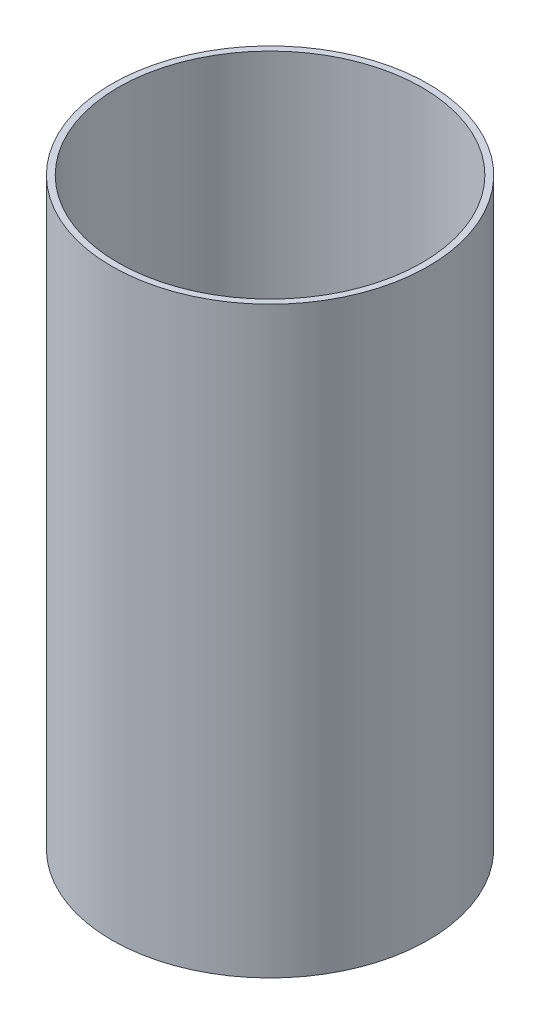
ISO-10303-21;
HEADER;
FILE_DESCRIPTION(('STEP AP214'),'2;1');
FILE_NAME('part.step','',(''),(''),'','','');
FILE_SCHEMA(('AUTOMOTIVE_DESIGN { 1 0 10303 214 1 1 1 1 }'));
ENDSEC;
DATA;
#1=APPLICATION_CONTEXT('core data for automotive mechanical design processes');
#2=APPLICATION_PROTOCOL_DEFINITION('international standard','automotive_design',2000,#1);
#3=PRODUCT_CONTEXT('',#1,'mechanical');
#4=PRODUCT('Part','Part','',(#3));
#5=PRODUCT_RELATED_PRODUCT_CATEGORY('part','',(#4));
#6=PRODUCT_DEFINITION_FORMATION('','',#4);
#7=PRODUCT_DEFINITION_CONTEXT('part definition',#1,'design');
#8=PRODUCT_DEFINITION('design','',#6,#7);
#9=PRODUCT_DEFINITION_SHAPE('','',#8);
#10=(LENGTH_UNIT() NAMED_UNIT(*) SI_UNIT(.MILLI.,.METRE.));
#11=(NAMED_UNIT(*) PLANE_ANGLE_UNIT() SI_UNIT($,.RADIAN.));
#12=(NAMED_UNIT(*) SI_UNIT($,.STERADIAN.) SOLID_ANGLE_UNIT());
#13=UNCERTAINTY_MEASURE_WITH_UNIT(LENGTH_MEASURE(1.E-05),#10,'distance_accuracy_value','');
#14=(GEOMETRIC_REPRESENTATION_CONTEXT(3) GLOBAL_UNCERTAINTY_ASSIGNED_CONTEXT((#13)) GLOBAL_UNIT_ASSIGNED_CONTEXT((#10,
#11,#12)) REPRESENTATION_CONTEXT('',''));
#15=CARTESIAN_POINT('',(0.,0.,0.));
#16=DIRECTION('',(0.,0.,1.));
#17=DIRECTION('',(1.,0.,0.));
#18=AXIS2_PLACEMENT_3D('',#15,#16,#17);
#19=CARTESIAN_POINT('',(0.,140.,0.));
#20=DIRECTION('',(0.,1.,0.));
#21=DIRECTION('',(0.,0.,1.));
#22=AXIS2_PLACEMENT_3D('',#19,#20,#21);
#23=PLANE('',#22);
#24=CARTESIAN_POINT('',(0.,140.,0.));
#25=DIRECTION('',(0.,1.,0.));
#26=DIRECTION('',(0.,0.,1.));
#27=AXIS2_PLACEMENT_3D('',#24,#25,#26);
#28=CIRCLE('',#27,37.95);
#29=CARTESIAN_POINT('',(0.,140.,37.95));
#30=VERTEX_POINT('',#29);
#31=EDGE_CURVE('E10',#30,#30,#28,.T.);
#32=ORIENTED_EDGE('',*,*,#31,.T.);
#33=EDGE_LOOP('',(#32));
#34=FACE_BOUND('',#33,.T.);
#35=CARTESIAN_POINT('',(0.,140.,0.));
#36=DIRECTION('',(0.,1.,0.));
#37=DIRECTION('',(0.,0.,1.));
#38=AXIS2_PLACEMENT_3D('',#35,#36,#37);
#39=CIRCLE('',#38,36.45);
#40=CARTESIAN_POINT('',(0.,140.,36.45));
#41=VERTEX_POINT('',#40);
#42=EDGE_CURVE('E44',#41,#41,#39,.T.);
#43=ORIENTED_EDGE('',*,*,#42,.F.);
#44=EDGE_LOOP('',(#43));
#45=FACE_BOUND('',#44,.T.);
#46=ADVANCED_FACE('F33',(#34,#45),#23,.T.);
#47=CARTESIAN_POINT('',(0.,0.,0.));
#48=DIRECTION('',(0.,1.,0.));
#49=DIRECTION('',(0.,0.,1.));
#50=AXIS2_PLACEMENT_3D('',#47,#48,#49);
#51=PLANE('',#50);
#52=CARTESIAN_POINT('',(0.,0.,0.));
#53=DIRECTION('',(0.,1.,0.));
#54=DIRECTION('',(0.,0.,1.));
#55=AXIS2_PLACEMENT_3D('',#52,#53,#54);
#56=CIRCLE('',#55,37.95);
#57=CARTESIAN_POINT('',(0.,0.,37.95));
#58=VERTEX_POINT('',#57);
#59=EDGE_CURVE('E37',#58,#58,#56,.T.);
#60=ORIENTED_EDGE('',*,*,#59,.F.);
#61=EDGE_LOOP('',(#60));
#62=FACE_BOUND('',#61,.T.);
#63=CARTESIAN_POINT('',(0.,0.,0.));
#64=DIRECTION('',(0.,1.,0.));
#65=DIRECTION('',(0.,0.,1.));
#66=AXIS2_PLACEMENT_3D('',#63,#64,#65);
#67=CIRCLE('',#66,36.45);
#68=CARTESIAN_POINT('',(0.,0.,36.45));
#69=VERTEX_POINT('',#68);
#70=EDGE_CURVE('E46',#69,#69,#67,.T.);
#71=ORIENTED_EDGE('',*,*,#70,.T.);
#72=EDGE_LOOP('',(#71));
#73=FACE_BOUND('',#72,.T.);
#74=ADVANCED_FACE('F56',(#62,#73),#51,.F.);
#75=CARTESIAN_POINT('',(0.,140.,0.));
#76=DIRECTION('',(0.,-1.,0.));
#77=DIRECTION('',(0.,0.,-1.));
#78=AXIS2_PLACEMENT_3D('',#75,#76,#77);
#79=CYLINDRICAL_SURFACE('',#78,37.95);
#80=ORIENTED_EDGE('',*,*,#31,.F.);
#81=EDGE_LOOP('',(#80));
#82=FACE_BOUND('',#81,.T.);
#83=ORIENTED_EDGE('',*,*,#59,.T.);
#84=EDGE_LOOP('',(#83));
#85=FACE_BOUND('',#84,.T.);
#86=ADVANCED_FACE('F35',(#82,#85),#79,.T.);
#87=CARTESIAN_POINT('',(0.,140.,0.));
#88=DIRECTION('',(0.,-1.,0.));
#89=DIRECTION('',(0.,0.,-1.));
#90=AXIS2_PLACEMENT_3D('',#87,#88,#89);
#91=CYLINDRICAL_SURFACE('',#90,36.45);
#92=ORIENTED_EDGE('',*,*,#42,.T.);
#93=EDGE_LOOP('',(#92));
#94=FACE_BOUND('',#93,.T.);
#95=ORIENTED_EDGE('',*,*,#70,.F.);
#96=EDGE_LOOP('',(#95));
#97=FACE_BOUND('',#96,.T.);
#98=ADVANCED_FACE('F52',(#94,#97),#91,.F.);
#99=CLOSED_SHELL('',(#46,#74,#86,#98));
#100=MANIFOLD_SOLID_BREP('B2',#99);
#101=ADVANCED_BREP_SHAPE_REPRESENTATION('',(#18,#100),#14);
#102=SHAPE_DEFINITION_REPRESENTATION(#9,#101);
ENDSEC;
END-ISO-10303-21;
